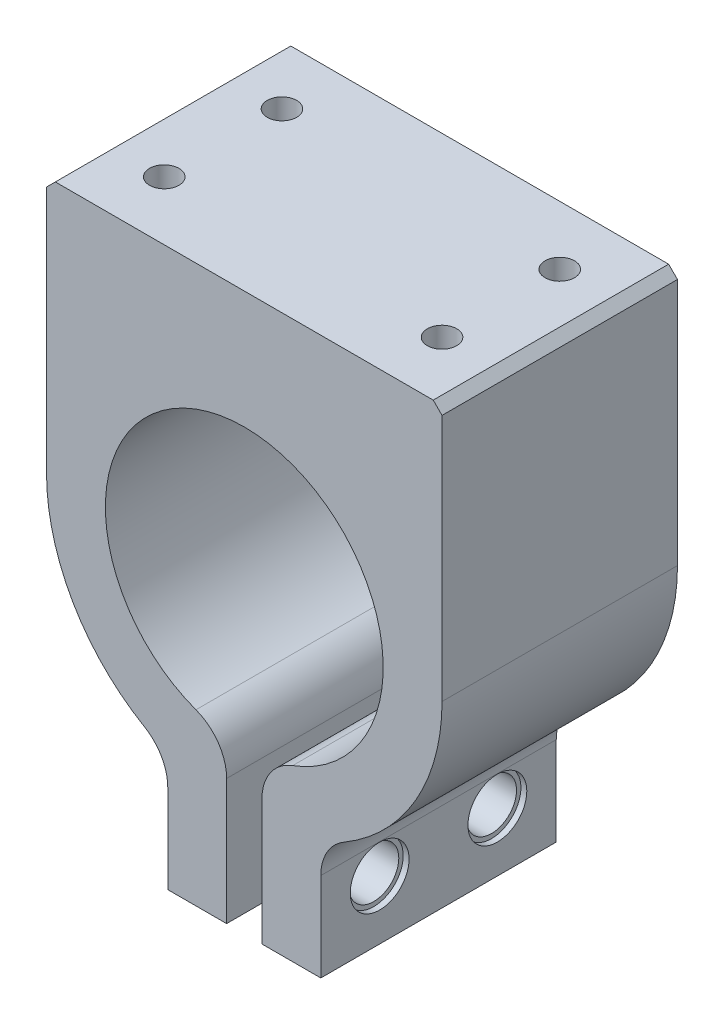
ISO-10303-21;
HEADER;
FILE_DESCRIPTION(('STEP AP214'),'2;1');
FILE_NAME('part.step','',(''),(''),'','','');
FILE_SCHEMA(('AUTOMOTIVE_DESIGN { 1 0 10303 214 1 1 1 1 }'));
ENDSEC;
DATA;
#1=APPLICATION_CONTEXT('core data for automotive mechanical design processes');
#2=APPLICATION_PROTOCOL_DEFINITION('international standard','automotive_design',2000,#1);
#3=PRODUCT_CONTEXT('',#1,'mechanical');
#4=PRODUCT('Part','Part','',(#3));
#5=PRODUCT_RELATED_PRODUCT_CATEGORY('part','',(#4));
#6=PRODUCT_DEFINITION_FORMATION('','',#4);
#7=PRODUCT_DEFINITION_CONTEXT('part definition',#1,'design');
#8=PRODUCT_DEFINITION('design','',#6,#7);
#9=PRODUCT_DEFINITION_SHAPE('','',#8);
#10=(LENGTH_UNIT() NAMED_UNIT(*) SI_UNIT(.MILLI.,.METRE.));
#11=(NAMED_UNIT(*) PLANE_ANGLE_UNIT() SI_UNIT($,.RADIAN.));
#12=(NAMED_UNIT(*) SI_UNIT($,.STERADIAN.) SOLID_ANGLE_UNIT());
#13=UNCERTAINTY_MEASURE_WITH_UNIT(LENGTH_MEASURE(1.E-05),#10,'distance_accuracy_value','');
#14=(GEOMETRIC_REPRESENTATION_CONTEXT(3) GLOBAL_UNCERTAINTY_ASSIGNED_CONTEXT((#13)) GLOBAL_UNIT_ASSIGNED_CONTEXT((#10,
#11,#12)) REPRESENTATION_CONTEXT('',''));
#15=CARTESIAN_POINT('',(0.,0.,0.));
#16=DIRECTION('',(0.,0.,1.));
#17=DIRECTION('',(1.,0.,0.));
#18=AXIS2_PLACEMENT_3D('',#15,#16,#17);
#19=CARTESIAN_POINT('',(6.49999999999999,0.,10.));
#20=DIRECTION('',(-1.,0.,0.));
#21=DIRECTION('',(0.,-1.,0.));
#22=AXIS2_PLACEMENT_3D('',#19,#20,#21);
#23=PLANE('',#22);
#24=CARTESIAN_POINT('',(6.5,-20.4916106328555,5.));
#25=DIRECTION('',(1.,0.,0.));
#26=DIRECTION('',(0.,0.,-1.));
#27=AXIS2_PLACEMENT_3D('',#24,#25,#26);
#28=CIRCLE('',#27,2.5);
#29=CARTESIAN_POINT('',(6.5,-20.4916106328555,2.5));
#30=VERTEX_POINT('',#29);
#31=EDGE_CURVE('E751',#30,#30,#28,.T.);
#32=ORIENTED_EDGE('',*,*,#31,.F.);
#33=EDGE_LOOP('',(#32));
#34=FACE_BOUND('',#33,.T.);
#35=CARTESIAN_POINT('',(6.5,-20.4916106328555,-5.));
#36=DIRECTION('',(1.,0.,0.));
#37=DIRECTION('',(0.,0.,-1.));
#38=AXIS2_PLACEMENT_3D('',#35,#36,#37);
#39=CIRCLE('',#38,2.5);
#40=CARTESIAN_POINT('',(6.5,-20.4916106328555,-7.5));
#41=VERTEX_POINT('',#40);
#42=EDGE_CURVE('E768',#41,#41,#39,.T.);
#43=ORIENTED_EDGE('',*,*,#42,.F.);
#44=EDGE_LOOP('',(#43));
#45=FACE_BOUND('',#44,.T.);
#46=DIRECTION('',(0.,1.,0.));
#47=VECTOR('',#46,1.);
#48=CARTESIAN_POINT('',(6.49999999999999,0.,-10.));
#49=LINE('',#48,#47);
#50=CARTESIAN_POINT('',(6.50000000000001,-25.4916106328555,-10.));
#51=VERTEX_POINT('',#50);
#52=CARTESIAN_POINT('',(6.5,-17.9552220816118,-10.));
#53=VERTEX_POINT('',#52);
#54=EDGE_CURVE('E217',#51,#53,#49,.T.);
#55=ORIENTED_EDGE('',*,*,#54,.T.);
#56=DIRECTION('',(0.,0.,-1.));
#57=VECTOR('',#56,1.);
#58=CARTESIAN_POINT('',(6.5,-17.9552220816118,10.));
#59=LINE('',#58,#57);
#60=CARTESIAN_POINT('',(6.5,-17.9552220816118,10.));
#61=VERTEX_POINT('',#60);
#62=EDGE_CURVE('E317',#53,#61,#59,.F.);
#63=ORIENTED_EDGE('',*,*,#62,.T.);
#64=DIRECTION('',(0.,1.,0.));
#65=VECTOR('',#64,1.);
#66=CARTESIAN_POINT('',(6.49999999999999,0.,10.));
#67=LINE('',#66,#65);
#68=CARTESIAN_POINT('',(6.50000000000001,-25.4916106328555,10.));
#69=VERTEX_POINT('',#68);
#70=EDGE_CURVE('E218',#69,#61,#67,.T.);
#71=ORIENTED_EDGE('',*,*,#70,.F.);
#72=DIRECTION('',(0.,0.,-1.));
#73=VECTOR('',#72,1.);
#74=CARTESIAN_POINT('',(6.50000000000001,-25.4916106328555,10.));
#75=LINE('',#74,#73);
#76=EDGE_CURVE('E250',#69,#51,#75,.T.);
#77=ORIENTED_EDGE('',*,*,#76,.T.);
#78=EDGE_LOOP('',(#55,#63,#71,#77));
#79=FACE_BOUND('',#78,.T.);
#80=ADVANCED_FACE('F43',(#34,#45,#79),#23,.F.);
#81=CARTESIAN_POINT('',(0.,0.,10.));
#82=DIRECTION('',(0.,0.,-1.));
#83=DIRECTION('',(-1.,0.,0.));
#84=AXIS2_PLACEMENT_3D('',#81,#82,#83);
#85=CYLINDRICAL_SURFACE('',#84,16.8);
#86=CARTESIAN_POINT('',(0.,0.,10.));
#87=DIRECTION('',(0.,0.,1.));
#88=DIRECTION('',(1.,0.,0.));
#89=AXIS2_PLACEMENT_3D('',#86,#87,#88);
#90=CIRCLE('',#89,16.8);
#91=CARTESIAN_POINT('',(16.8,0.,10.));
#92=VERTEX_POINT('',#91);
#93=CARTESIAN_POINT('',(8.48076923076923,-14.5022947582249,10.));
#94=VERTEX_POINT('',#93);
#95=EDGE_CURVE('E221',#92,#94,#90,.F.);
#96=ORIENTED_EDGE('',*,*,#95,.T.);
#97=DIRECTION('',(0.,0.,-1.));
#98=VECTOR('',#97,1.);
#99=CARTESIAN_POINT('',(8.48076923076923,-14.5022947582249,10.));
#100=LINE('',#99,#98);
#101=CARTESIAN_POINT('',(8.48076923076923,-14.5022947582249,-10.));
#102=VERTEX_POINT('',#101);
#103=EDGE_CURVE('E314',#94,#102,#100,.T.);
#104=ORIENTED_EDGE('',*,*,#103,.T.);
#105=CARTESIAN_POINT('',(0.,0.,-10.));
#106=DIRECTION('',(0.,0.,1.));
#107=DIRECTION('',(1.,0.,0.));
#108=AXIS2_PLACEMENT_3D('',#105,#106,#107);
#109=CIRCLE('',#108,16.8);
#110=CARTESIAN_POINT('',(16.8,0.,-10.));
#111=VERTEX_POINT('',#110);
#112=EDGE_CURVE('E253',#111,#102,#109,.F.);
#113=ORIENTED_EDGE('',*,*,#112,.F.);
#114=DIRECTION('',(0.,0.,-1.));
#115=VECTOR('',#114,1.);
#116=CARTESIAN_POINT('',(16.8,0.,10.));
#117=LINE('',#116,#115);
#118=EDGE_CURVE('E293',#92,#111,#117,.T.);
#119=ORIENTED_EDGE('',*,*,#118,.F.);
#120=EDGE_LOOP('',(#96,#104,#113,#119));
#121=FACE_BOUND('',#120,.T.);
#122=ADVANCED_FACE('F358',(#121),#85,.T.);
#123=CARTESIAN_POINT('',(16.8,0.,10.));
#124=DIRECTION('',(1.,0.,0.));
#125=DIRECTION('',(0.,0.,-1.));
#126=AXIS2_PLACEMENT_3D('',#123,#124,#125);
#127=PLANE('',#126);
#128=DIRECTION('',(0.,-1.,0.));
#129=VECTOR('',#128,1.);
#130=CARTESIAN_POINT('',(16.8,0.,-10.));
#131=LINE('',#130,#129);
#132=CARTESIAN_POINT('',(16.8,21.05,-10.));
#133=VERTEX_POINT('',#132);
#134=EDGE_CURVE('E256',#133,#111,#131,.T.);
#135=ORIENTED_EDGE('',*,*,#134,.F.);
#136=DIRECTION('',(0.,0.,1.));
#137=VECTOR('',#136,1.);
#138=CARTESIAN_POINT('',(16.8,21.05,10.));
#139=LINE('',#138,#137);
#140=CARTESIAN_POINT('',(16.8,21.05,10.));
#141=VERTEX_POINT('',#140);
#142=EDGE_CURVE('E67',#133,#141,#139,.T.);
#143=ORIENTED_EDGE('',*,*,#142,.T.);
#144=DIRECTION('',(0.,-1.,0.));
#145=VECTOR('',#144,1.);
#146=CARTESIAN_POINT('',(16.8,0.,10.));
#147=LINE('',#146,#145);
#148=EDGE_CURVE('E225',#141,#92,#147,.T.);
#149=ORIENTED_EDGE('',*,*,#148,.T.);
#150=ORIENTED_EDGE('',*,*,#118,.T.);
#151=EDGE_LOOP('',(#135,#143,#149,#150));
#152=FACE_BOUND('',#151,.T.);
#153=ADVANCED_FACE('F354',(#152),#127,.T.);
#154=CARTESIAN_POINT('',(0.,21.8,10.));
#155=DIRECTION('',(0.,1.,0.));
#156=DIRECTION('',(0.,0.,1.));
#157=AXIS2_PLACEMENT_3D('',#154,#155,#156);
#158=PLANE('',#157);
#159=CARTESIAN_POINT('',(-11.8,21.8,-5.));
#160=DIRECTION('',(0.,1.,0.));
#161=DIRECTION('',(0.,0.,1.));
#162=AXIS2_PLACEMENT_3D('',#159,#160,#161);
#163=CIRCLE('',#162,1.25);
#164=CARTESIAN_POINT('',(-11.8,21.8,-3.75));
#165=VERTEX_POINT('',#164);
#166=EDGE_CURVE('E193',#165,#165,#163,.T.);
#167=ORIENTED_EDGE('',*,*,#166,.F.);
#168=EDGE_LOOP('',(#167));
#169=FACE_BOUND('',#168,.T.);
#170=CARTESIAN_POINT('',(11.8,21.8,-5.));
#171=DIRECTION('',(0.,1.,0.));
#172=DIRECTION('',(0.,0.,1.));
#173=AXIS2_PLACEMENT_3D('',#170,#171,#172);
#174=CIRCLE('',#173,1.25);
#175=CARTESIAN_POINT('',(11.8,21.8,-3.75));
#176=VERTEX_POINT('',#175);
#177=EDGE_CURVE('E192',#176,#176,#174,.T.);
#178=ORIENTED_EDGE('',*,*,#177,.F.);
#179=EDGE_LOOP('',(#178));
#180=FACE_BOUND('',#179,.T.);
#181=CARTESIAN_POINT('',(11.8,21.8,5.));
#182=DIRECTION('',(0.,1.,0.));
#183=DIRECTION('',(0.,0.,1.));
#184=AXIS2_PLACEMENT_3D('',#181,#182,#183);
#185=CIRCLE('',#184,1.25);
#186=CARTESIAN_POINT('',(11.8,21.8,6.25));
#187=VERTEX_POINT('',#186);
#188=EDGE_CURVE('E205',#187,#187,#185,.T.);
#189=ORIENTED_EDGE('',*,*,#188,.F.);
#190=EDGE_LOOP('',(#189));
#191=FACE_BOUND('',#190,.T.);
#192=CARTESIAN_POINT('',(-11.8,21.8,5.));
#193=DIRECTION('',(0.,1.,0.));
#194=DIRECTION('',(0.,0.,1.));
#195=AXIS2_PLACEMENT_3D('',#192,#193,#194);
#196=CIRCLE('',#195,1.25);
#197=CARTESIAN_POINT('',(-11.8,21.8,6.25));
#198=VERTEX_POINT('',#197);
#199=EDGE_CURVE('E211',#198,#198,#196,.T.);
#200=ORIENTED_EDGE('',*,*,#199,.F.);
#201=EDGE_LOOP('',(#200));
#202=FACE_BOUND('',#201,.T.);
#203=DIRECTION('',(1.,0.,0.));
#204=VECTOR('',#203,1.);
#205=CARTESIAN_POINT('',(0.,21.8,10.));
#206=LINE('',#205,#204);
#207=CARTESIAN_POINT('',(-16.05,21.8,10.));
#208=VERTEX_POINT('',#207);
#209=CARTESIAN_POINT('',(16.05,21.8,10.));
#210=VERTEX_POINT('',#209);
#211=EDGE_CURVE('E227',#208,#210,#206,.T.);
#212=ORIENTED_EDGE('',*,*,#211,.T.);
#213=DIRECTION('',(0.,0.,-1.));
#214=VECTOR('',#213,1.);
#215=CARTESIAN_POINT('',(16.05,21.8,10.));
#216=LINE('',#215,#214);
#217=CARTESIAN_POINT('',(16.05,21.8,-10.));
#218=VERTEX_POINT('',#217);
#219=EDGE_CURVE('E334',#210,#218,#216,.T.);
#220=ORIENTED_EDGE('',*,*,#219,.T.);
#221=DIRECTION('',(1.,0.,0.));
#222=VECTOR('',#221,1.);
#223=CARTESIAN_POINT('',(0.,21.8,-10.));
#224=LINE('',#223,#222);
#225=CARTESIAN_POINT('',(-16.05,21.8,-10.));
#226=VERTEX_POINT('',#225);
#227=EDGE_CURVE('E258',#226,#218,#224,.T.);
#228=ORIENTED_EDGE('',*,*,#227,.F.);
#229=DIRECTION('',(0.,0.,1.));
#230=VECTOR('',#229,1.);
#231=CARTESIAN_POINT('',(-16.05,21.8,10.));
#232=LINE('',#231,#230);
#233=EDGE_CURVE('E332',#226,#208,#232,.T.);
#234=ORIENTED_EDGE('',*,*,#233,.T.);
#235=EDGE_LOOP('',(#212,#220,#228,#234));
#236=FACE_BOUND('',#235,.T.);
#237=ADVANCED_FACE('F348',(#169,#180,#191,#202,#236),#158,.T.);
#238=CARTESIAN_POINT('',(-16.8,0.,10.));
#239=DIRECTION('',(-1.,0.,0.));
#240=DIRECTION('',(0.,0.,1.));
#241=AXIS2_PLACEMENT_3D('',#238,#239,#240);
#242=PLANE('',#241);
#243=DIRECTION('',(0.,1.,0.));
#244=VECTOR('',#243,1.);
#245=CARTESIAN_POINT('',(-16.8,0.,10.));
#246=LINE('',#245,#244);
#247=CARTESIAN_POINT('',(-16.8,0.,10.));
#248=VERTEX_POINT('',#247);
#249=CARTESIAN_POINT('',(-16.8,21.05,10.));
#250=VERTEX_POINT('',#249);
#251=EDGE_CURVE('E230',#248,#250,#246,.T.);
#252=ORIENTED_EDGE('',*,*,#251,.T.);
#253=DIRECTION('',(0.,0.,-1.));
#254=VECTOR('',#253,1.);
#255=CARTESIAN_POINT('',(-16.8,21.05,10.));
#256=LINE('',#255,#254);
#257=CARTESIAN_POINT('',(-16.8,21.05,-10.));
#258=VERTEX_POINT('',#257);
#259=EDGE_CURVE('E11',#250,#258,#256,.T.);
#260=ORIENTED_EDGE('',*,*,#259,.T.);
#261=DIRECTION('',(0.,1.,0.));
#262=VECTOR('',#261,1.);
#263=CARTESIAN_POINT('',(-16.8,0.,-10.));
#264=LINE('',#263,#262);
#265=CARTESIAN_POINT('',(-16.8,0.,-10.));
#266=VERTEX_POINT('',#265);
#267=EDGE_CURVE('E261',#266,#258,#264,.T.);
#268=ORIENTED_EDGE('',*,*,#267,.F.);
#269=DIRECTION('',(0.,0.,-1.));
#270=VECTOR('',#269,1.);
#271=CARTESIAN_POINT('',(-16.8,0.,10.));
#272=LINE('',#271,#270);
#273=EDGE_CURVE('E290',#248,#266,#272,.T.);
#274=ORIENTED_EDGE('',*,*,#273,.F.);
#275=EDGE_LOOP('',(#252,#260,#268,#274));
#276=FACE_BOUND('',#275,.T.);
#277=ADVANCED_FACE('F415',(#276),#242,.T.);
#278=CARTESIAN_POINT('',(0.,0.,10.));
#279=DIRECTION('',(0.,0.,-1.));
#280=DIRECTION('',(-1.,0.,0.));
#281=AXIS2_PLACEMENT_3D('',#278,#279,#280);
#282=CYLINDRICAL_SURFACE('',#281,16.8);
#283=CARTESIAN_POINT('',(0.,0.,-10.));
#284=DIRECTION('',(0.,0.,1.));
#285=DIRECTION('',(1.,0.,0.));
#286=AXIS2_PLACEMENT_3D('',#283,#284,#285);
#287=CIRCLE('',#286,16.8);
#288=CARTESIAN_POINT('',(-8.48076923076923,-14.5022947582249,-10.));
#289=VERTEX_POINT('',#288);
#290=EDGE_CURVE('E264',#289,#266,#287,.F.);
#291=ORIENTED_EDGE('',*,*,#290,.F.);
#292=DIRECTION('',(0.,0.,-1.));
#293=VECTOR('',#292,1.);
#294=CARTESIAN_POINT('',(-8.48076923076923,-14.5022947582249,10.));
#295=LINE('',#294,#293);
#296=CARTESIAN_POINT('',(-8.48076923076923,-14.5022947582249,10.));
#297=VERTEX_POINT('',#296);
#298=EDGE_CURVE('E322',#289,#297,#295,.F.);
#299=ORIENTED_EDGE('',*,*,#298,.T.);
#300=CARTESIAN_POINT('',(0.,0.,10.));
#301=DIRECTION('',(0.,0.,1.));
#302=DIRECTION('',(1.,0.,0.));
#303=AXIS2_PLACEMENT_3D('',#300,#301,#302);
#304=CIRCLE('',#303,16.8);
#305=EDGE_CURVE('E232',#297,#248,#304,.F.);
#306=ORIENTED_EDGE('',*,*,#305,.T.);
#307=ORIENTED_EDGE('',*,*,#273,.T.);
#308=EDGE_LOOP('',(#291,#299,#306,#307));
#309=FACE_BOUND('',#308,.T.);
#310=ADVANCED_FACE('F411',(#309),#282,.T.);
#311=CARTESIAN_POINT('',(-6.5,0.,10.));
#312=DIRECTION('',(-1.,0.,0.));
#313=DIRECTION('',(0.,-1.,0.));
#314=AXIS2_PLACEMENT_3D('',#311,#312,#313);
#315=PLANE('',#314);
#316=CARTESIAN_POINT('',(-6.5,-20.4916106328555,-5.));
#317=DIRECTION('',(-1.,0.,0.));
#318=DIRECTION('',(0.,0.,1.));
#319=AXIS2_PLACEMENT_3D('',#316,#317,#318);
#320=CIRCLE('',#319,1.7);
#321=CARTESIAN_POINT('',(-6.5,-20.4916106328555,-3.3));
#322=VERTEX_POINT('',#321);
#323=EDGE_CURVE('E742',#322,#322,#320,.T.);
#324=ORIENTED_EDGE('',*,*,#323,.F.);
#325=EDGE_LOOP('',(#324));
#326=FACE_BOUND('',#325,.T.);
#327=CARTESIAN_POINT('',(-6.5,-20.4916106328555,5.));
#328=DIRECTION('',(-1.,0.,0.));
#329=DIRECTION('',(0.,0.,1.));
#330=AXIS2_PLACEMENT_3D('',#327,#328,#329);
#331=CIRCLE('',#330,1.7);
#332=CARTESIAN_POINT('',(-6.5,-20.4916106328555,6.7));
#333=VERTEX_POINT('',#332);
#334=EDGE_CURVE('E745',#333,#333,#331,.T.);
#335=ORIENTED_EDGE('',*,*,#334,.F.);
#336=EDGE_LOOP('',(#335));
#337=FACE_BOUND('',#336,.T.);
#338=DIRECTION('',(0.,1.,0.));
#339=VECTOR('',#338,1.);
#340=CARTESIAN_POINT('',(-6.5,0.,10.));
#341=LINE('',#340,#339);
#342=CARTESIAN_POINT('',(-6.5,-25.4916106328555,10.));
#343=VERTEX_POINT('',#342);
#344=CARTESIAN_POINT('',(-6.5,-17.9552220816118,10.));
#345=VERTEX_POINT('',#344);
#346=EDGE_CURVE('E234',#343,#345,#341,.T.);
#347=ORIENTED_EDGE('',*,*,#346,.T.);
#348=DIRECTION('',(0.,0.,1.));
#349=VECTOR('',#348,1.);
#350=CARTESIAN_POINT('',(-6.5,-17.9552220816118,-10.));
#351=LINE('',#350,#349);
#352=CARTESIAN_POINT('',(-6.5,-17.9552220816118,-10.));
#353=VERTEX_POINT('',#352);
#354=EDGE_CURVE('E319',#345,#353,#351,.F.);
#355=ORIENTED_EDGE('',*,*,#354,.T.);
#356=DIRECTION('',(0.,1.,0.));
#357=VECTOR('',#356,1.);
#358=CARTESIAN_POINT('',(-6.5,0.,-10.));
#359=LINE('',#358,#357);
#360=CARTESIAN_POINT('',(-6.5,-25.4916106328555,-10.));
#361=VERTEX_POINT('',#360);
#362=EDGE_CURVE('E266',#361,#353,#359,.T.);
#363=ORIENTED_EDGE('',*,*,#362,.F.);
#364=DIRECTION('',(0.,0.,-1.));
#365=VECTOR('',#364,1.);
#366=CARTESIAN_POINT('',(-6.5,-25.4916106328555,10.));
#367=LINE('',#366,#365);
#368=EDGE_CURVE('E288',#343,#361,#367,.T.);
#369=ORIENTED_EDGE('',*,*,#368,.F.);
#370=EDGE_LOOP('',(#347,#355,#363,#369));
#371=FACE_BOUND('',#370,.T.);
#372=ADVANCED_FACE('F402',(#326,#337,#371),#315,.T.);
#373=CARTESIAN_POINT('',(0.,-25.4916106328555,10.));
#374=DIRECTION('',(0.,-1.,0.));
#375=DIRECTION('',(0.,0.,-1.));
#376=AXIS2_PLACEMENT_3D('',#373,#374,#375);
#377=PLANE('',#376);
#378=DIRECTION('',(-1.,0.,0.));
#379=VECTOR('',#378,1.);
#380=CARTESIAN_POINT('',(0.,-25.4916106328555,-10.));
#381=LINE('',#380,#379);
#382=CARTESIAN_POINT('',(-1.5,-25.4916106328555,-10.));
#383=VERTEX_POINT('',#382);
#384=EDGE_CURVE('E269',#383,#361,#381,.T.);
#385=ORIENTED_EDGE('',*,*,#384,.F.);
#386=DIRECTION('',(0.,0.,-1.));
#387=VECTOR('',#386,1.);
#388=CARTESIAN_POINT('',(-1.5,-25.4916106328555,10.));
#389=LINE('',#388,#387);
#390=CARTESIAN_POINT('',(-1.5,-25.4916106328555,10.));
#391=VERTEX_POINT('',#390);
#392=EDGE_CURVE('E286',#391,#383,#389,.T.);
#393=ORIENTED_EDGE('',*,*,#392,.F.);
#394=DIRECTION('',(-1.,0.,0.));
#395=VECTOR('',#394,1.);
#396=CARTESIAN_POINT('',(0.,-25.4916106328555,10.));
#397=LINE('',#396,#395);
#398=EDGE_CURVE('E237',#391,#343,#397,.T.);
#399=ORIENTED_EDGE('',*,*,#398,.T.);
#400=ORIENTED_EDGE('',*,*,#368,.T.);
#401=EDGE_LOOP('',(#385,#393,#399,#400));
#402=FACE_BOUND('',#401,.T.);
#403=ADVANCED_FACE('F398',(#402),#377,.T.);
#404=CARTESIAN_POINT('',(-1.5,0.,10.));
#405=DIRECTION('',(-1.,0.,0.));
#406=DIRECTION('',(0.,0.,1.));
#407=AXIS2_PLACEMENT_3D('',#404,#405,#406);
#408=PLANE('',#407);
#409=CARTESIAN_POINT('',(-1.5,-20.4916106328555,-5.));
#410=DIRECTION('',(-1.,0.,0.));
#411=DIRECTION('',(0.,0.,1.));
#412=AXIS2_PLACEMENT_3D('',#409,#410,#411);
#413=CIRCLE('',#412,1.7);
#414=CARTESIAN_POINT('',(-1.5,-20.4916106328555,-3.3));
#415=VERTEX_POINT('',#414);
#416=EDGE_CURVE('E748',#415,#415,#413,.T.);
#417=ORIENTED_EDGE('',*,*,#416,.T.);
#418=EDGE_LOOP('',(#417));
#419=FACE_BOUND('',#418,.T.);
#420=CARTESIAN_POINT('',(-1.5,-20.4916106328555,5.));
#421=DIRECTION('',(-1.,0.,0.));
#422=DIRECTION('',(0.,0.,1.));
#423=AXIS2_PLACEMENT_3D('',#420,#421,#422);
#424=CIRCLE('',#423,1.7);
#425=CARTESIAN_POINT('',(-1.5,-20.4916106328555,6.7));
#426=VERTEX_POINT('',#425);
#427=EDGE_CURVE('E747',#426,#426,#424,.T.);
#428=ORIENTED_EDGE('',*,*,#427,.T.);
#429=EDGE_LOOP('',(#428));
#430=FACE_BOUND('',#429,.T.);
#431=DIRECTION('',(0.,1.,0.));
#432=VECTOR('',#431,1.);
#433=CARTESIAN_POINT('',(-1.5,0.,-10.));
#434=LINE('',#433,#432);
#435=CARTESIAN_POINT('',(-1.5,-14.8118196046266,-10.));
#436=VERTEX_POINT('',#435);
#437=EDGE_CURVE('E272',#383,#436,#434,.T.);
#438=ORIENTED_EDGE('',*,*,#437,.T.);
#439=DIRECTION('',(0.,0.,1.));
#440=VECTOR('',#439,1.);
#441=CARTESIAN_POINT('',(-1.5,-14.8118196046266,10.));
#442=LINE('',#441,#440);
#443=CARTESIAN_POINT('',(-1.5,-14.8118196046266,10.));
#444=VERTEX_POINT('',#443);
#445=EDGE_CURVE('E305',#436,#444,#442,.T.);
#446=ORIENTED_EDGE('',*,*,#445,.T.);
#447=DIRECTION('',(0.,1.,0.));
#448=VECTOR('',#447,1.);
#449=CARTESIAN_POINT('',(-1.5,0.,10.));
#450=LINE('',#449,#448);
#451=EDGE_CURVE('E240',#391,#444,#450,.T.);
#452=ORIENTED_EDGE('',*,*,#451,.F.);
#453=ORIENTED_EDGE('',*,*,#392,.T.);
#454=EDGE_LOOP('',(#438,#446,#452,#453));
#455=FACE_BOUND('',#454,.T.);
#456=ADVANCED_FACE('F396',(#419,#430,#455),#408,.F.);
#457=CARTESIAN_POINT('',(0.,0.,10.));
#458=DIRECTION('',(0.,0.,-1.));
#459=DIRECTION('',(-1.,0.,0.));
#460=AXIS2_PLACEMENT_3D('',#457,#458,#459);
#461=CYLINDRICAL_SURFACE('',#460,11.8);
#462=CARTESIAN_POINT('',(0.,0.,10.));
#463=DIRECTION('',(0.,0.,1.));
#464=DIRECTION('',(1.,0.,0.));
#465=AXIS2_PLACEMENT_3D('',#462,#463,#464);
#466=CIRCLE('',#465,11.8);
#467=CARTESIAN_POINT('',(4.10759493670886,-11.0619918566198,10.));
#468=VERTEX_POINT('',#467);
#469=CARTESIAN_POINT('',(-4.10759493670886,-11.0619918566198,10.));
#470=VERTEX_POINT('',#469);
#471=EDGE_CURVE('E243',#468,#470,#466,.T.);
#472=ORIENTED_EDGE('',*,*,#471,.T.);
#473=DIRECTION('',(0.,0.,-1.));
#474=VECTOR('',#473,1.);
#475=CARTESIAN_POINT('',(-4.10759493670886,-11.0619918566198,10.));
#476=LINE('',#475,#474);
#477=CARTESIAN_POINT('',(-4.10759493670886,-11.0619918566198,-10.));
#478=VERTEX_POINT('',#477);
#479=EDGE_CURVE('E298',#470,#478,#476,.T.);
#480=ORIENTED_EDGE('',*,*,#479,.T.);
#481=CARTESIAN_POINT('',(0.,0.,-10.));
#482=DIRECTION('',(0.,0.,1.));
#483=DIRECTION('',(1.,0.,0.));
#484=AXIS2_PLACEMENT_3D('',#481,#482,#483);
#485=CIRCLE('',#484,11.8);
#486=CARTESIAN_POINT('',(4.10759493670886,-11.0619918566198,-10.));
#487=VERTEX_POINT('',#486);
#488=EDGE_CURVE('E275',#487,#478,#485,.T.);
#489=ORIENTED_EDGE('',*,*,#488,.F.);
#490=DIRECTION('',(0.,0.,-1.));
#491=VECTOR('',#490,1.);
#492=CARTESIAN_POINT('',(4.10759493670886,-11.0619918566198,10.));
#493=LINE('',#492,#491);
#494=EDGE_CURVE('E296',#487,#468,#493,.F.);
#495=ORIENTED_EDGE('',*,*,#494,.T.);
#496=EDGE_LOOP('',(#472,#480,#489,#495));
#497=FACE_BOUND('',#496,.T.);
#498=ADVANCED_FACE('F385',(#497),#461,.F.);
#499=CARTESIAN_POINT('',(1.5,0.,10.));
#500=DIRECTION('',(1.,0.,0.));
#501=DIRECTION('',(0.,1.,0.));
#502=AXIS2_PLACEMENT_3D('',#499,#500,#501);
#503=PLANE('',#502);
#504=CARTESIAN_POINT('',(1.5,-20.4916106328555,5.));
#505=DIRECTION('',(1.,0.,0.));
#506=DIRECTION('',(0.,0.,-1.));
#507=AXIS2_PLACEMENT_3D('',#504,#505,#506);
#508=CIRCLE('',#507,2.125);
#509=CARTESIAN_POINT('',(1.5,-20.4916106328555,2.875));
#510=VERTEX_POINT('',#509);
#511=EDGE_CURVE('E765',#510,#510,#508,.T.);
#512=ORIENTED_EDGE('',*,*,#511,.T.);
#513=EDGE_LOOP('',(#512));
#514=FACE_BOUND('',#513,.T.);
#515=CARTESIAN_POINT('',(1.5,-20.4916106328555,-5.));
#516=DIRECTION('',(1.,0.,0.));
#517=DIRECTION('',(0.,0.,-1.));
#518=AXIS2_PLACEMENT_3D('',#515,#516,#517);
#519=CIRCLE('',#518,2.125);
#520=CARTESIAN_POINT('',(1.5,-20.4916106328555,-7.125));
#521=VERTEX_POINT('',#520);
#522=EDGE_CURVE('E199',#521,#521,#519,.T.);
#523=ORIENTED_EDGE('',*,*,#522,.T.);
#524=EDGE_LOOP('',(#523));
#525=FACE_BOUND('',#524,.T.);
#526=DIRECTION('',(0.,-1.,0.));
#527=VECTOR('',#526,1.);
#528=CARTESIAN_POINT('',(1.5,0.,10.));
#529=LINE('',#528,#527);
#530=CARTESIAN_POINT('',(1.5,-14.8118196046266,10.));
#531=VERTEX_POINT('',#530);
#532=CARTESIAN_POINT('',(1.5,-25.4916106328555,10.));
#533=VERTEX_POINT('',#532);
#534=EDGE_CURVE('E246',#531,#533,#529,.T.);
#535=ORIENTED_EDGE('',*,*,#534,.F.);
#536=DIRECTION('',(0.,0.,1.));
#537=VECTOR('',#536,1.);
#538=CARTESIAN_POINT('',(1.5,-14.8118196046266,-10.));
#539=LINE('',#538,#537);
#540=CARTESIAN_POINT('',(1.5,-14.8118196046266,-10.));
#541=VERTEX_POINT('',#540);
#542=EDGE_CURVE('E311',#531,#541,#539,.F.);
#543=ORIENTED_EDGE('',*,*,#542,.T.);
#544=DIRECTION('',(0.,-1.,0.));
#545=VECTOR('',#544,1.);
#546=CARTESIAN_POINT('',(1.5,0.,-10.));
#547=LINE('',#546,#545);
#548=CARTESIAN_POINT('',(1.5,-25.4916106328555,-10.));
#549=VERTEX_POINT('',#548);
#550=EDGE_CURVE('E278',#541,#549,#547,.T.);
#551=ORIENTED_EDGE('',*,*,#550,.T.);
#552=DIRECTION('',(0.,0.,-1.));
#553=VECTOR('',#552,1.);
#554=CARTESIAN_POINT('',(1.5,-25.4916106328555,10.));
#555=LINE('',#554,#553);
#556=EDGE_CURVE('E283',#533,#549,#555,.T.);
#557=ORIENTED_EDGE('',*,*,#556,.F.);
#558=EDGE_LOOP('',(#535,#543,#551,#557));
#559=FACE_BOUND('',#558,.T.);
#560=ADVANCED_FACE('F377',(#514,#525,#559),#503,.F.);
#561=CARTESIAN_POINT('',(0.,-25.4916106328555,10.));
#562=DIRECTION('',(0.,1.,0.));
#563=DIRECTION('',(0.,0.,1.));
#564=AXIS2_PLACEMENT_3D('',#561,#562,#563);
#565=PLANE('',#564);
#566=DIRECTION('',(1.,0.,0.));
#567=VECTOR('',#566,1.);
#568=CARTESIAN_POINT('',(0.,-25.4916106328555,-10.));
#569=LINE('',#568,#567);
#570=EDGE_CURVE('E222',#549,#51,#569,.T.);
#571=ORIENTED_EDGE('',*,*,#570,.T.);
#572=ORIENTED_EDGE('',*,*,#76,.F.);
#573=DIRECTION('',(1.,0.,0.));
#574=VECTOR('',#573,1.);
#575=CARTESIAN_POINT('',(0.,-25.4916106328555,10.));
#576=LINE('',#575,#574);
#577=EDGE_CURVE('E248',#533,#69,#576,.T.);
#578=ORIENTED_EDGE('',*,*,#577,.F.);
#579=ORIENTED_EDGE('',*,*,#556,.T.);
#580=EDGE_LOOP('',(#571,#572,#578,#579));
#581=FACE_BOUND('',#580,.T.);
#582=ADVANCED_FACE('F373',(#581),#565,.F.);
#583=CARTESIAN_POINT('',(0.,0.,10.));
#584=DIRECTION('',(0.,0.,1.));
#585=DIRECTION('',(1.,0.,0.));
#586=AXIS2_PLACEMENT_3D('',#583,#584,#585);
#587=PLANE('',#586);
#588=ORIENTED_EDGE('',*,*,#148,.F.);
#589=DIRECTION('',(0.707106781186544,-0.707106781186551,0.));
#590=VECTOR('',#589,1.);
#591=CARTESIAN_POINT('',(18.9250000000001,18.9249999999999,10.));
#592=LINE('',#591,#590);
#593=EDGE_CURVE('E52',#141,#210,#592,.F.);
#594=ORIENTED_EDGE('',*,*,#593,.T.);
#595=ORIENTED_EDGE('',*,*,#211,.F.);
#596=DIRECTION('',(0.707106781186548,0.707106781186548,0.));
#597=VECTOR('',#596,1.);
#598=CARTESIAN_POINT('',(-18.925,18.925,10.));
#599=LINE('',#598,#597);
#600=EDGE_CURVE('E59',#208,#250,#599,.F.);
#601=ORIENTED_EDGE('',*,*,#600,.T.);
#602=ORIENTED_EDGE('',*,*,#251,.F.);
#603=ORIENTED_EDGE('',*,*,#305,.F.);
#604=CARTESIAN_POINT('',(-10.5,-17.9552220816118,10.));
#605=DIRECTION('',(0.,0.,1.));
#606=DIRECTION('',(1.,0.,0.));
#607=AXIS2_PLACEMENT_3D('',#604,#605,#606);
#608=CIRCLE('',#607,4.);
#609=EDGE_CURVE('E330',#297,#345,#608,.F.);
#610=ORIENTED_EDGE('',*,*,#609,.T.);
#611=ORIENTED_EDGE('',*,*,#346,.F.);
#612=ORIENTED_EDGE('',*,*,#398,.F.);
#613=ORIENTED_EDGE('',*,*,#451,.T.);
#614=CARTESIAN_POINT('',(-5.5,-14.8118196046266,10.));
#615=DIRECTION('',(0.,0.,1.));
#616=DIRECTION('',(1.,0.,0.));
#617=AXIS2_PLACEMENT_3D('',#614,#615,#616);
#618=CIRCLE('',#617,4.);
#619=EDGE_CURVE('E309',#444,#470,#618,.T.);
#620=ORIENTED_EDGE('',*,*,#619,.T.);
#621=ORIENTED_EDGE('',*,*,#471,.F.);
#622=CARTESIAN_POINT('',(5.5,-14.8118196046266,10.));
#623=DIRECTION('',(0.,0.,1.));
#624=DIRECTION('',(1.,0.,0.));
#625=AXIS2_PLACEMENT_3D('',#622,#623,#624);
#626=CIRCLE('',#625,4.);
#627=EDGE_CURVE('E307',#468,#531,#626,.T.);
#628=ORIENTED_EDGE('',*,*,#627,.T.);
#629=ORIENTED_EDGE('',*,*,#534,.T.);
#630=ORIENTED_EDGE('',*,*,#577,.T.);
#631=ORIENTED_EDGE('',*,*,#70,.T.);
#632=CARTESIAN_POINT('',(10.5,-17.9552220816118,10.));
#633=DIRECTION('',(0.,0.,1.));
#634=DIRECTION('',(1.,0.,0.));
#635=AXIS2_PLACEMENT_3D('',#632,#633,#634);
#636=CIRCLE('',#635,4.);
#637=EDGE_CURVE('E326',#61,#94,#636,.F.);
#638=ORIENTED_EDGE('',*,*,#637,.T.);
#639=ORIENTED_EDGE('',*,*,#95,.F.);
#640=EDGE_LOOP('',(#588,#594,#595,#601,#602,#603,#610,#611,#612,#613,#620,#621,#628,#629,#630,
#631,#638,#639));
#641=FACE_BOUND('',#640,.T.);
#642=ADVANCED_FACE('F343',(#641),#587,.T.);
#643=CARTESIAN_POINT('',(0.,0.,-10.));
#644=DIRECTION('',(0.,0.,1.));
#645=DIRECTION('',(1.,0.,0.));
#646=AXIS2_PLACEMENT_3D('',#643,#644,#645);
#647=PLANE('',#646);
#648=ORIENTED_EDGE('',*,*,#227,.T.);
#649=DIRECTION('',(-0.707106781186544,0.707106781186551,0.));
#650=VECTOR('',#649,1.);
#651=CARTESIAN_POINT('',(16.05,21.8,-10.));
#652=LINE('',#651,#650);
#653=EDGE_CURVE('E339',#218,#133,#652,.F.);
#654=ORIENTED_EDGE('',*,*,#653,.T.);
#655=ORIENTED_EDGE('',*,*,#134,.T.);
#656=ORIENTED_EDGE('',*,*,#112,.T.);
#657=CARTESIAN_POINT('',(10.5,-17.9552220816118,-10.));
#658=DIRECTION('',(0.,0.,1.));
#659=DIRECTION('',(1.,0.,0.));
#660=AXIS2_PLACEMENT_3D('',#657,#658,#659);
#661=CIRCLE('',#660,4.);
#662=EDGE_CURVE('E324',#102,#53,#661,.T.);
#663=ORIENTED_EDGE('',*,*,#662,.T.);
#664=ORIENTED_EDGE('',*,*,#54,.F.);
#665=ORIENTED_EDGE('',*,*,#570,.F.);
#666=ORIENTED_EDGE('',*,*,#550,.F.);
#667=CARTESIAN_POINT('',(5.5,-14.8118196046266,-10.));
#668=DIRECTION('',(0.,0.,1.));
#669=DIRECTION('',(1.,0.,0.));
#670=AXIS2_PLACEMENT_3D('',#667,#668,#669);
#671=CIRCLE('',#670,4.);
#672=EDGE_CURVE('E301',#541,#487,#671,.F.);
#673=ORIENTED_EDGE('',*,*,#672,.T.);
#674=ORIENTED_EDGE('',*,*,#488,.T.);
#675=CARTESIAN_POINT('',(-5.5,-14.8118196046266,-10.));
#676=DIRECTION('',(0.,0.,1.));
#677=DIRECTION('',(1.,0.,0.));
#678=AXIS2_PLACEMENT_3D('',#675,#676,#677);
#679=CIRCLE('',#678,4.);
#680=EDGE_CURVE('E303',#478,#436,#679,.F.);
#681=ORIENTED_EDGE('',*,*,#680,.T.);
#682=ORIENTED_EDGE('',*,*,#437,.F.);
#683=ORIENTED_EDGE('',*,*,#384,.T.);
#684=ORIENTED_EDGE('',*,*,#362,.T.);
#685=CARTESIAN_POINT('',(-10.5,-17.9552220816118,-10.));
#686=DIRECTION('',(0.,0.,1.));
#687=DIRECTION('',(1.,0.,0.));
#688=AXIS2_PLACEMENT_3D('',#685,#686,#687);
#689=CIRCLE('',#688,4.);
#690=EDGE_CURVE('E328',#353,#289,#689,.T.);
#691=ORIENTED_EDGE('',*,*,#690,.T.);
#692=ORIENTED_EDGE('',*,*,#290,.T.);
#693=ORIENTED_EDGE('',*,*,#267,.T.);
#694=DIRECTION('',(-0.707106781186548,-0.707106781186548,0.));
#695=VECTOR('',#694,1.);
#696=CARTESIAN_POINT('',(-16.8,21.05,-10.));
#697=LINE('',#696,#695);
#698=EDGE_CURVE('E337',#258,#226,#697,.F.);
#699=ORIENTED_EDGE('',*,*,#698,.T.);
#700=EDGE_LOOP('',(#648,#654,#655,#656,#663,#664,#665,#666,#673,#674,#681,#682,#683,#684,#691,
#692,#693,#699));
#701=FACE_BOUND('',#700,.T.);
#702=ADVANCED_FACE('F353',(#701),#647,.F.);
#703=CARTESIAN_POINT('',(-11.8,11.8,5.));
#704=DIRECTION('',(0.,1.,0.));
#705=DIRECTION('',(0.,0.,1.));
#706=AXIS2_PLACEMENT_3D('',#703,#704,#705);
#707=CONICAL_SURFACE('',#706,1.25,0.785398163397446);
#708=CARTESIAN_POINT('',(-11.8,10.55,5.));
#709=VERTEX_POINT('',#708);
#710=VERTEX_LOOP('',#709);
#711=FACE_BOUND('',#710,.T.);
#712=CARTESIAN_POINT('',(-11.8,11.8,5.));
#713=DIRECTION('',(0.,1.,0.));
#714=DIRECTION('',(0.,0.,1.));
#715=AXIS2_PLACEMENT_3D('',#712,#713,#714);
#716=CIRCLE('',#715,1.25);
#717=CARTESIAN_POINT('',(-11.8,11.8,6.25));
#718=VERTEX_POINT('',#717);
#719=EDGE_CURVE('E214',#718,#718,#716,.T.);
#720=ORIENTED_EDGE('',*,*,#719,.T.);
#721=EDGE_LOOP('',(#720));
#722=FACE_BOUND('',#721,.T.);
#723=ADVANCED_FACE('F489',(#711,#722),#707,.F.);
#724=CARTESIAN_POINT('',(-11.8,21.8,5.));
#725=DIRECTION('',(0.,1.,0.));
#726=DIRECTION('',(0.,0.,1.));
#727=AXIS2_PLACEMENT_3D('',#724,#725,#726);
#728=CYLINDRICAL_SURFACE('',#727,1.25);
#729=ORIENTED_EDGE('',*,*,#719,.F.);
#730=EDGE_LOOP('',(#729));
#731=FACE_BOUND('',#730,.T.);
#732=ORIENTED_EDGE('',*,*,#199,.T.);
#733=EDGE_LOOP('',(#732));
#734=FACE_BOUND('',#733,.T.);
#735=ADVANCED_FACE('F633',(#731,#734),#728,.F.);
#736=CARTESIAN_POINT('',(11.8,11.8,5.));
#737=DIRECTION('',(0.,1.,0.));
#738=DIRECTION('',(0.,0.,1.));
#739=AXIS2_PLACEMENT_3D('',#736,#737,#738);
#740=CONICAL_SURFACE('',#739,1.25,0.785398163397446);
#741=CARTESIAN_POINT('',(11.8,10.55,5.));
#742=VERTEX_POINT('',#741);
#743=VERTEX_LOOP('',#742);
#744=FACE_BOUND('',#743,.T.);
#745=CARTESIAN_POINT('',(11.8,11.8,5.));
#746=DIRECTION('',(0.,1.,0.));
#747=DIRECTION('',(0.,0.,1.));
#748=AXIS2_PLACEMENT_3D('',#745,#746,#747);
#749=CIRCLE('',#748,1.25);
#750=CARTESIAN_POINT('',(11.8,11.8,6.25));
#751=VERTEX_POINT('',#750);
#752=EDGE_CURVE('E208',#751,#751,#749,.T.);
#753=ORIENTED_EDGE('',*,*,#752,.T.);
#754=EDGE_LOOP('',(#753));
#755=FACE_BOUND('',#754,.T.);
#756=ADVANCED_FACE('F624',(#744,#755),#740,.F.);
#757=CARTESIAN_POINT('',(11.8,21.8,5.));
#758=DIRECTION('',(0.,1.,0.));
#759=DIRECTION('',(0.,0.,1.));
#760=AXIS2_PLACEMENT_3D('',#757,#758,#759);
#761=CYLINDRICAL_SURFACE('',#760,1.25);
#762=ORIENTED_EDGE('',*,*,#752,.F.);
#763=EDGE_LOOP('',(#762));
#764=FACE_BOUND('',#763,.T.);
#765=ORIENTED_EDGE('',*,*,#188,.T.);
#766=EDGE_LOOP('',(#765));
#767=FACE_BOUND('',#766,.T.);
#768=ADVANCED_FACE('F615',(#764,#767),#761,.F.);
#769=CARTESIAN_POINT('',(11.8,11.8,-5.));
#770=DIRECTION('',(0.,1.,0.));
#771=DIRECTION('',(0.,0.,1.));
#772=AXIS2_PLACEMENT_3D('',#769,#770,#771);
#773=CONICAL_SURFACE('',#772,1.25,0.785398163397446);
#774=CARTESIAN_POINT('',(11.8,10.55,-5.));
#775=VERTEX_POINT('',#774);
#776=VERTEX_LOOP('',#775);
#777=FACE_BOUND('',#776,.T.);
#778=CARTESIAN_POINT('',(11.8,11.8,-5.));
#779=DIRECTION('',(0.,1.,0.));
#780=DIRECTION('',(0.,0.,1.));
#781=AXIS2_PLACEMENT_3D('',#778,#779,#780);
#782=CIRCLE('',#781,1.25);
#783=CARTESIAN_POINT('',(11.8,11.8,-3.75));
#784=VERTEX_POINT('',#783);
#785=EDGE_CURVE('E196',#784,#784,#782,.T.);
#786=ORIENTED_EDGE('',*,*,#785,.T.);
#787=EDGE_LOOP('',(#786));
#788=FACE_BOUND('',#787,.T.);
#789=ADVANCED_FACE('F606',(#777,#788),#773,.F.);
#790=CARTESIAN_POINT('',(11.8,21.8,-5.));
#791=DIRECTION('',(0.,1.,0.));
#792=DIRECTION('',(0.,0.,1.));
#793=AXIS2_PLACEMENT_3D('',#790,#791,#792);
#794=CYLINDRICAL_SURFACE('',#793,1.25);
#795=ORIENTED_EDGE('',*,*,#785,.F.);
#796=EDGE_LOOP('',(#795));
#797=FACE_BOUND('',#796,.T.);
#798=ORIENTED_EDGE('',*,*,#177,.T.);
#799=EDGE_LOOP('',(#798));
#800=FACE_BOUND('',#799,.T.);
#801=ADVANCED_FACE('F186',(#797,#800),#794,.F.);
#802=CARTESIAN_POINT('',(-11.8,11.8,-5.));
#803=DIRECTION('',(0.,1.,0.));
#804=DIRECTION('',(0.,0.,1.));
#805=AXIS2_PLACEMENT_3D('',#802,#803,#804);
#806=CONICAL_SURFACE('',#805,1.25,0.785398163397446);
#807=CARTESIAN_POINT('',(-11.8,10.55,-5.));
#808=VERTEX_POINT('',#807);
#809=VERTEX_LOOP('',#808);
#810=FACE_BOUND('',#809,.T.);
#811=CARTESIAN_POINT('',(-11.8,11.8,-5.));
#812=DIRECTION('',(0.,1.,0.));
#813=DIRECTION('',(0.,0.,1.));
#814=AXIS2_PLACEMENT_3D('',#811,#812,#813);
#815=CIRCLE('',#814,1.25);
#816=CARTESIAN_POINT('',(-11.8,11.8,-3.75));
#817=VERTEX_POINT('',#816);
#818=EDGE_CURVE('E190',#817,#817,#815,.T.);
#819=ORIENTED_EDGE('',*,*,#818,.T.);
#820=EDGE_LOOP('',(#819));
#821=FACE_BOUND('',#820,.T.);
#822=ADVANCED_FACE('F182',(#810,#821),#806,.F.);
#823=CARTESIAN_POINT('',(-11.8,21.8,-5.));
#824=DIRECTION('',(0.,1.,0.));
#825=DIRECTION('',(0.,0.,1.));
#826=AXIS2_PLACEMENT_3D('',#823,#824,#825);
#827=CYLINDRICAL_SURFACE('',#826,1.25);
#828=ORIENTED_EDGE('',*,*,#818,.F.);
#829=EDGE_LOOP('',(#828));
#830=FACE_BOUND('',#829,.T.);
#831=ORIENTED_EDGE('',*,*,#166,.T.);
#832=EDGE_LOOP('',(#831));
#833=FACE_BOUND('',#832,.T.);
#834=ADVANCED_FACE('F185',(#830,#833),#827,.F.);
#835=CARTESIAN_POINT('',(6.5,-20.4916106328555,-5.));
#836=DIRECTION('',(1.,0.,0.));
#837=DIRECTION('',(0.,0.,-1.));
#838=AXIS2_PLACEMENT_3D('',#835,#836,#837);
#839=CYLINDRICAL_SURFACE('',#838,2.125);
#840=ORIENTED_EDGE('',*,*,#522,.F.);
#841=EDGE_LOOP('',(#840));
#842=FACE_BOUND('',#841,.T.);
#843=CARTESIAN_POINT('',(6.,-20.4916106328555,-5.));
#844=DIRECTION('',(1.,0.,0.));
#845=DIRECTION('',(0.,0.,-1.));
#846=AXIS2_PLACEMENT_3D('',#843,#844,#845);
#847=CIRCLE('',#846,2.125);
#848=CARTESIAN_POINT('',(6.,-20.4916106328555,-7.125));
#849=VERTEX_POINT('',#848);
#850=EDGE_CURVE('E774',#849,#849,#847,.T.);
#851=ORIENTED_EDGE('',*,*,#850,.T.);
#852=EDGE_LOOP('',(#851));
#853=FACE_BOUND('',#852,.T.);
#854=ADVANCED_FACE('F577',(#842,#853),#839,.F.);
#855=CARTESIAN_POINT('',(6.,-18.3666106328555,-5.));
#856=DIRECTION('',(-1.,0.,0.));
#857=DIRECTION('',(0.,0.,1.));
#858=AXIS2_PLACEMENT_3D('',#855,#856,#857);
#859=PLANE('',#858);
#860=ORIENTED_EDGE('',*,*,#850,.F.);
#861=EDGE_LOOP('',(#860));
#862=FACE_BOUND('',#861,.T.);
#863=CARTESIAN_POINT('',(6.,-20.4916106328555,-5.));
#864=DIRECTION('',(1.,0.,0.));
#865=DIRECTION('',(0.,0.,-1.));
#866=AXIS2_PLACEMENT_3D('',#863,#864,#865);
#867=CIRCLE('',#866,2.5);
#868=CARTESIAN_POINT('',(6.,-20.4916106328555,-7.5));
#869=VERTEX_POINT('',#868);
#870=EDGE_CURVE('E771',#869,#869,#867,.T.);
#871=ORIENTED_EDGE('',*,*,#870,.T.);
#872=EDGE_LOOP('',(#871));
#873=FACE_BOUND('',#872,.T.);
#874=ADVANCED_FACE('F568',(#862,#873),#859,.F.);
#875=CARTESIAN_POINT('',(6.5,-20.4916106328555,-5.));
#876=DIRECTION('',(1.,0.,0.));
#877=DIRECTION('',(0.,0.,-1.));
#878=AXIS2_PLACEMENT_3D('',#875,#876,#877);
#879=CYLINDRICAL_SURFACE('',#878,2.5);
#880=ORIENTED_EDGE('',*,*,#870,.F.);
#881=EDGE_LOOP('',(#880));
#882=FACE_BOUND('',#881,.T.);
#883=ORIENTED_EDGE('',*,*,#42,.T.);
#884=EDGE_LOOP('',(#883));
#885=FACE_BOUND('',#884,.T.);
#886=ADVANCED_FACE('F559',(#882,#885),#879,.F.);
#887=CARTESIAN_POINT('',(6.5,-20.4916106328555,5.));
#888=DIRECTION('',(1.,0.,0.));
#889=DIRECTION('',(0.,0.,-1.));
#890=AXIS2_PLACEMENT_3D('',#887,#888,#889);
#891=CYLINDRICAL_SURFACE('',#890,2.125);
#892=ORIENTED_EDGE('',*,*,#511,.F.);
#893=EDGE_LOOP('',(#892));
#894=FACE_BOUND('',#893,.T.);
#895=CARTESIAN_POINT('',(6.,-20.4916106328555,5.));
#896=DIRECTION('',(1.,0.,0.));
#897=DIRECTION('',(0.,0.,-1.));
#898=AXIS2_PLACEMENT_3D('',#895,#896,#897);
#899=CIRCLE('',#898,2.125);
#900=CARTESIAN_POINT('',(6.,-20.4916106328555,2.875));
#901=VERTEX_POINT('',#900);
#902=EDGE_CURVE('E762',#901,#901,#899,.T.);
#903=ORIENTED_EDGE('',*,*,#902,.T.);
#904=EDGE_LOOP('',(#903));
#905=FACE_BOUND('',#904,.T.);
#906=ADVANCED_FACE('F550',(#894,#905),#891,.F.);
#907=CARTESIAN_POINT('',(6.,-18.3666106328555,5.));
#908=DIRECTION('',(-1.,0.,0.));
#909=DIRECTION('',(0.,0.,1.));
#910=AXIS2_PLACEMENT_3D('',#907,#908,#909);
#911=PLANE('',#910);
#912=ORIENTED_EDGE('',*,*,#902,.F.);
#913=EDGE_LOOP('',(#912));
#914=FACE_BOUND('',#913,.T.);
#915=CARTESIAN_POINT('',(6.,-20.4916106328555,5.));
#916=DIRECTION('',(1.,0.,0.));
#917=DIRECTION('',(0.,0.,-1.));
#918=AXIS2_PLACEMENT_3D('',#915,#916,#917);
#919=CIRCLE('',#918,2.5);
#920=CARTESIAN_POINT('',(6.,-20.4916106328555,2.5));
#921=VERTEX_POINT('',#920);
#922=EDGE_CURVE('E759',#921,#921,#919,.T.);
#923=ORIENTED_EDGE('',*,*,#922,.T.);
#924=EDGE_LOOP('',(#923));
#925=FACE_BOUND('',#924,.T.);
#926=ADVANCED_FACE('F541',(#914,#925),#911,.F.);
#927=CARTESIAN_POINT('',(6.5,-20.4916106328555,5.));
#928=DIRECTION('',(1.,0.,0.));
#929=DIRECTION('',(0.,0.,-1.));
#930=AXIS2_PLACEMENT_3D('',#927,#928,#929);
#931=CYLINDRICAL_SURFACE('',#930,2.5);
#932=ORIENTED_EDGE('',*,*,#922,.F.);
#933=EDGE_LOOP('',(#932));
#934=FACE_BOUND('',#933,.T.);
#935=ORIENTED_EDGE('',*,*,#31,.T.);
#936=EDGE_LOOP('',(#935));
#937=FACE_BOUND('',#936,.T.);
#938=ADVANCED_FACE('F532',(#934,#937),#931,.F.);
#939=CARTESIAN_POINT('',(-6.5,-20.4916106328555,5.));
#940=DIRECTION('',(-1.,0.,0.));
#941=DIRECTION('',(0.,0.,1.));
#942=AXIS2_PLACEMENT_3D('',#939,#940,#941);
#943=CYLINDRICAL_SURFACE('',#942,1.7);
#944=ORIENTED_EDGE('',*,*,#427,.F.);
#945=EDGE_LOOP('',(#944));
#946=FACE_BOUND('',#945,.T.);
#947=ORIENTED_EDGE('',*,*,#334,.T.);
#948=EDGE_LOOP('',(#947));
#949=FACE_BOUND('',#948,.T.);
#950=ADVANCED_FACE('F523',(#946,#949),#943,.F.);
#951=CARTESIAN_POINT('',(-6.5,-20.4916106328555,-5.));
#952=DIRECTION('',(-1.,0.,0.));
#953=DIRECTION('',(0.,0.,1.));
#954=AXIS2_PLACEMENT_3D('',#951,#952,#953);
#955=CYLINDRICAL_SURFACE('',#954,1.7);
#956=ORIENTED_EDGE('',*,*,#416,.F.);
#957=EDGE_LOOP('',(#956));
#958=FACE_BOUND('',#957,.T.);
#959=ORIENTED_EDGE('',*,*,#323,.T.);
#960=EDGE_LOOP('',(#959));
#961=FACE_BOUND('',#960,.T.);
#962=ADVANCED_FACE('F436',(#958,#961),#955,.F.);
#963=CARTESIAN_POINT('',(-5.5,-14.8118196046266,10.));
#964=DIRECTION('',(0.,0.,-1.));
#965=DIRECTION('',(-1.,0.,0.));
#966=AXIS2_PLACEMENT_3D('',#963,#964,#965);
#967=CYLINDRICAL_SURFACE('',#966,4.);
#968=ORIENTED_EDGE('',*,*,#619,.F.);
#969=ORIENTED_EDGE('',*,*,#445,.F.);
#970=ORIENTED_EDGE('',*,*,#680,.F.);
#971=ORIENTED_EDGE('',*,*,#479,.F.);
#972=EDGE_LOOP('',(#968,#969,#970,#971));
#973=FACE_BOUND('',#972,.T.);
#974=ADVANCED_FACE('F392',(#973),#967,.T.);
#975=CARTESIAN_POINT('',(5.5,-14.8118196046266,10.));
#976=DIRECTION('',(0.,0.,-1.));
#977=DIRECTION('',(-1.,0.,0.));
#978=AXIS2_PLACEMENT_3D('',#975,#976,#977);
#979=CYLINDRICAL_SURFACE('',#978,4.);
#980=ORIENTED_EDGE('',*,*,#627,.F.);
#981=ORIENTED_EDGE('',*,*,#494,.F.);
#982=ORIENTED_EDGE('',*,*,#672,.F.);
#983=ORIENTED_EDGE('',*,*,#542,.F.);
#984=EDGE_LOOP('',(#980,#981,#982,#983));
#985=FACE_BOUND('',#984,.T.);
#986=ADVANCED_FACE('F381',(#985),#979,.T.);
#987=CARTESIAN_POINT('',(10.5,-17.9552220816118,10.));
#988=DIRECTION('',(0.,0.,-1.));
#989=DIRECTION('',(-1.,0.,0.));
#990=AXIS2_PLACEMENT_3D('',#987,#988,#989);
#991=CYLINDRICAL_SURFACE('',#990,4.);
#992=ORIENTED_EDGE('',*,*,#637,.F.);
#993=ORIENTED_EDGE('',*,*,#62,.F.);
#994=ORIENTED_EDGE('',*,*,#662,.F.);
#995=ORIENTED_EDGE('',*,*,#103,.F.);
#996=EDGE_LOOP('',(#992,#993,#994,#995));
#997=FACE_BOUND('',#996,.T.);
#998=ADVANCED_FACE('F368',(#997),#991,.F.);
#999=CARTESIAN_POINT('',(-10.5,-17.9552220816118,10.));
#1000=DIRECTION('',(0.,0.,-1.));
#1001=DIRECTION('',(-1.,0.,0.));
#1002=AXIS2_PLACEMENT_3D('',#999,#1000,#1001);
#1003=CYLINDRICAL_SURFACE('',#1002,4.);
#1004=ORIENTED_EDGE('',*,*,#609,.F.);
#1005=ORIENTED_EDGE('',*,*,#298,.F.);
#1006=ORIENTED_EDGE('',*,*,#690,.F.);
#1007=ORIENTED_EDGE('',*,*,#354,.F.);
#1008=EDGE_LOOP('',(#1004,#1005,#1006,#1007));
#1009=FACE_BOUND('',#1008,.T.);
#1010=ADVANCED_FACE('F407',(#1009),#1003,.F.);
#1011=CARTESIAN_POINT('',(16.05,21.8,10.));
#1012=DIRECTION('',(-0.707106781186551,-0.707106781186544,0.));
#1013=DIRECTION('',(0.,0.,-1.));
#1014=AXIS2_PLACEMENT_3D('',#1011,#1012,#1013);
#1015=PLANE('',#1014);
#1016=ORIENTED_EDGE('',*,*,#593,.F.);
#1017=ORIENTED_EDGE('',*,*,#142,.F.);
#1018=ORIENTED_EDGE('',*,*,#653,.F.);
#1019=ORIENTED_EDGE('',*,*,#219,.F.);
#1020=EDGE_LOOP('',(#1016,#1017,#1018,#1019));
#1021=FACE_BOUND('',#1020,.T.);
#1022=ADVANCED_FACE('F351',(#1021),#1015,.F.);
#1023=CARTESIAN_POINT('',(-16.8,21.05,10.));
#1024=DIRECTION('',(0.707106781186548,-0.707106781186548,0.));
#1025=DIRECTION('',(0.,0.,-1.));
#1026=AXIS2_PLACEMENT_3D('',#1023,#1024,#1025);
#1027=PLANE('',#1026);
#1028=ORIENTED_EDGE('',*,*,#600,.F.);
#1029=ORIENTED_EDGE('',*,*,#233,.F.);
#1030=ORIENTED_EDGE('',*,*,#698,.F.);
#1031=ORIENTED_EDGE('',*,*,#259,.F.);
#1032=EDGE_LOOP('',(#1028,#1029,#1030,#1031));
#1033=FACE_BOUND('',#1032,.T.);
#1034=ADVANCED_FACE('F46',(#1033),#1027,.F.);
#1035=CLOSED_SHELL('',(#80,#122,#153,#237,#277,#310,#372,#403,#456,#498,#560,#582,#642,#702,
#723,#735,#756,#768,#789,#801,#822,#834,#854,#874,#886,#906,#926,#938,#950,#962,#974,#986,#998,
#1010,#1022,#1034));
#1036=MANIFOLD_SOLID_BREP('B2',#1035);
#1037=ADVANCED_BREP_SHAPE_REPRESENTATION('',(#18,#1036),#14);
#1038=SHAPE_DEFINITION_REPRESENTATION(#9,#1037);
ENDSEC;
END-ISO-10303-21;
